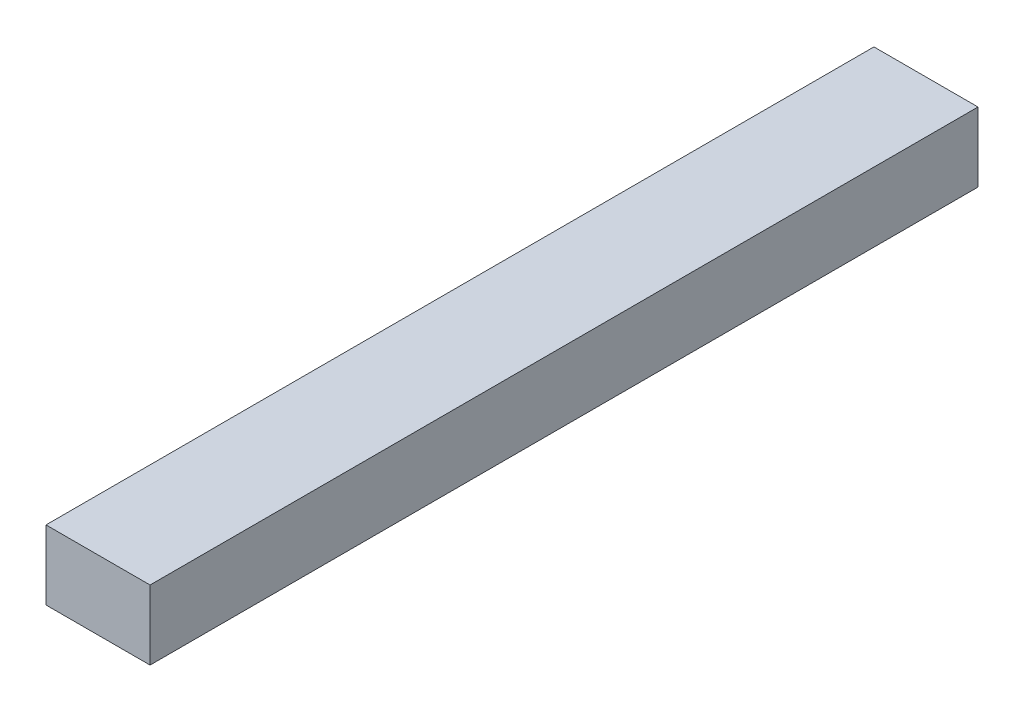
ISO-10303-21;
HEADER;
FILE_DESCRIPTION(('STEP AP214'),'2;1');
FILE_NAME('part.step','',(''),(''),'','','');
FILE_SCHEMA(('AUTOMOTIVE_DESIGN { 1 0 10303 214 1 1 1 1 }'));
ENDSEC;
DATA;
#1=APPLICATION_CONTEXT('core data for automotive mechanical design processes');
#2=APPLICATION_PROTOCOL_DEFINITION('international standard','automotive_design',2000,#1);
#3=PRODUCT_CONTEXT('',#1,'mechanical');
#4=PRODUCT('Part','Part','',(#3));
#5=PRODUCT_RELATED_PRODUCT_CATEGORY('part','',(#4));
#6=PRODUCT_DEFINITION_FORMATION('','',#4);
#7=PRODUCT_DEFINITION_CONTEXT('part definition',#1,'design');
#8=PRODUCT_DEFINITION('design','',#6,#7);
#9=PRODUCT_DEFINITION_SHAPE('','',#8);
#10=(LENGTH_UNIT() NAMED_UNIT(*) SI_UNIT(.MILLI.,.METRE.));
#11=(NAMED_UNIT(*) PLANE_ANGLE_UNIT() SI_UNIT($,.RADIAN.));
#12=(NAMED_UNIT(*) SI_UNIT($,.STERADIAN.) SOLID_ANGLE_UNIT());
#13=UNCERTAINTY_MEASURE_WITH_UNIT(LENGTH_MEASURE(1.E-05),#10,'distance_accuracy_value','');
#14=(GEOMETRIC_REPRESENTATION_CONTEXT(3) GLOBAL_UNCERTAINTY_ASSIGNED_CONTEXT((#13)) GLOBAL_UNIT_ASSIGNED_CONTEXT((#10,
#11,#12)) REPRESENTATION_CONTEXT('',''));
#15=CARTESIAN_POINT('',(0.,0.,0.));
#16=DIRECTION('',(0.,0.,1.));
#17=DIRECTION('',(1.,0.,0.));
#18=AXIS2_PLACEMENT_3D('',#15,#16,#17);
#19=CARTESIAN_POINT('',(-47.1690143822712,38.2481336624736,358.));
#20=DIRECTION('',(1.,0.,0.));
#21=DIRECTION('',(0.,0.,-1.));
#22=AXIS2_PLACEMENT_3D('',#19,#20,#21);
#23=PLANE('',#22);
#24=DIRECTION('',(0.,-1.,0.));
#25=VECTOR('',#24,1.);
#26=CARTESIAN_POINT('',(-47.1690143822712,38.2481336624736,0.));
#27=LINE('',#26,#25);
#28=CARTESIAN_POINT('',(-47.1690143822712,38.2481336624736,0.));
#29=VERTEX_POINT('',#28);
#30=CARTESIAN_POINT('',(-47.1690143822712,8.24813366247365,0.));
#31=VERTEX_POINT('',#30);
#32=EDGE_CURVE('E95',#29,#31,#27,.T.);
#33=ORIENTED_EDGE('',*,*,#32,.T.);
#34=DIRECTION('',(0.,0.,-1.));
#35=VECTOR('',#34,1.);
#36=CARTESIAN_POINT('',(-47.1690143822712,8.24813366247365,358.));
#37=LINE('',#36,#35);
#38=CARTESIAN_POINT('',(-47.1690143822712,8.24813366247365,358.));
#39=VERTEX_POINT('',#38);
#40=EDGE_CURVE('E11',#39,#31,#37,.T.);
#41=ORIENTED_EDGE('',*,*,#40,.F.);
#42=DIRECTION('',(0.,-1.,0.));
#43=VECTOR('',#42,1.);
#44=CARTESIAN_POINT('',(-47.1690143822712,38.2481336624736,358.));
#45=LINE('',#44,#43);
#46=CARTESIAN_POINT('',(-47.1690143822712,38.2481336624736,358.));
#47=VERTEX_POINT('',#46);
#48=EDGE_CURVE('E83',#47,#39,#45,.T.);
#49=ORIENTED_EDGE('',*,*,#48,.F.);
#50=DIRECTION('',(0.,0.,-1.));
#51=VECTOR('',#50,1.);
#52=CARTESIAN_POINT('',(-47.1690143822712,38.2481336624736,358.));
#53=LINE('',#52,#51);
#54=EDGE_CURVE('E91',#47,#29,#53,.T.);
#55=ORIENTED_EDGE('',*,*,#54,.T.);
#56=EDGE_LOOP('',(#33,#41,#49,#55));
#57=FACE_BOUND('',#56,.T.);
#58=ADVANCED_FACE('F32',(#57),#23,.F.);
#59=CARTESIAN_POINT('',(-47.1690143822712,8.24813366247365,358.));
#60=DIRECTION('',(0.,1.,0.));
#61=DIRECTION('',(0.,0.,1.));
#62=AXIS2_PLACEMENT_3D('',#59,#60,#61);
#63=PLANE('',#62);
#64=DIRECTION('',(1.,0.,0.));
#65=VECTOR('',#64,1.);
#66=CARTESIAN_POINT('',(-47.1690143822712,8.24813366247365,0.));
#67=LINE('',#66,#65);
#68=CARTESIAN_POINT('',(-2.16901438227123,8.24813366247365,0.));
#69=VERTEX_POINT('',#68);
#70=EDGE_CURVE('E87',#31,#69,#67,.T.);
#71=ORIENTED_EDGE('',*,*,#70,.T.);
#72=DIRECTION('',(0.,0.,-1.));
#73=VECTOR('',#72,1.);
#74=CARTESIAN_POINT('',(-2.16901438227123,8.24813366247365,358.));
#75=LINE('',#74,#73);
#76=CARTESIAN_POINT('',(-2.16901438227123,8.24813366247365,358.));
#77=VERTEX_POINT('',#76);
#78=EDGE_CURVE('E40',#77,#69,#75,.T.);
#79=ORIENTED_EDGE('',*,*,#78,.F.);
#80=DIRECTION('',(1.,0.,0.));
#81=VECTOR('',#80,1.);
#82=CARTESIAN_POINT('',(-47.1690143822712,8.24813366247365,358.));
#83=LINE('',#82,#81);
#84=EDGE_CURVE('E78',#39,#77,#83,.T.);
#85=ORIENTED_EDGE('',*,*,#84,.F.);
#86=ORIENTED_EDGE('',*,*,#40,.T.);
#87=EDGE_LOOP('',(#71,#79,#85,#86));
#88=FACE_BOUND('',#87,.T.);
#89=ADVANCED_FACE('F86',(#88),#63,.F.);
#90=CARTESIAN_POINT('',(-2.16901438227123,8.24813366247365,358.));
#91=DIRECTION('',(-1.,0.,0.));
#92=DIRECTION('',(0.,0.,1.));
#93=AXIS2_PLACEMENT_3D('',#90,#91,#92);
#94=PLANE('',#93);
#95=DIRECTION('',(0.,1.,0.));
#96=VECTOR('',#95,1.);
#97=CARTESIAN_POINT('',(-2.16901438227123,8.24813366247365,0.));
#98=LINE('',#97,#96);
#99=CARTESIAN_POINT('',(-2.16901438227123,38.2481336624736,0.));
#100=VERTEX_POINT('',#99);
#101=EDGE_CURVE('E65',#69,#100,#98,.T.);
#102=ORIENTED_EDGE('',*,*,#101,.T.);
#103=DIRECTION('',(0.,0.,-1.));
#104=VECTOR('',#103,1.);
#105=CARTESIAN_POINT('',(-2.16901438227123,38.2481336624736,358.));
#106=LINE('',#105,#104);
#107=CARTESIAN_POINT('',(-2.16901438227123,38.2481336624736,358.));
#108=VERTEX_POINT('',#107);
#109=EDGE_CURVE('E88',#108,#100,#106,.T.);
#110=ORIENTED_EDGE('',*,*,#109,.F.);
#111=DIRECTION('',(0.,1.,0.));
#112=VECTOR('',#111,1.);
#113=CARTESIAN_POINT('',(-2.16901438227123,8.24813366247365,358.));
#114=LINE('',#113,#112);
#115=EDGE_CURVE('E81',#77,#108,#114,.T.);
#116=ORIENTED_EDGE('',*,*,#115,.F.);
#117=ORIENTED_EDGE('',*,*,#78,.T.);
#118=EDGE_LOOP('',(#102,#110,#116,#117));
#119=FACE_BOUND('',#118,.T.);
#120=ADVANCED_FACE('F89',(#119),#94,.F.);
#121=CARTESIAN_POINT('',(-2.16901438227123,38.2481336624736,358.));
#122=DIRECTION('',(0.,-1.,0.));
#123=DIRECTION('',(0.,0.,-1.));
#124=AXIS2_PLACEMENT_3D('',#121,#122,#123);
#125=PLANE('',#124);
#126=DIRECTION('',(-1.,0.,0.));
#127=VECTOR('',#126,1.);
#128=CARTESIAN_POINT('',(-2.16901438227123,38.2481336624736,0.));
#129=LINE('',#128,#127);
#130=EDGE_CURVE('E71',#100,#29,#129,.T.);
#131=ORIENTED_EDGE('',*,*,#130,.T.);
#132=ORIENTED_EDGE('',*,*,#54,.F.);
#133=DIRECTION('',(-1.,0.,0.));
#134=VECTOR('',#133,1.);
#135=CARTESIAN_POINT('',(-2.16901438227123,38.2481336624736,358.));
#136=LINE('',#135,#134);
#137=EDGE_CURVE('E48',#108,#47,#136,.T.);
#138=ORIENTED_EDGE('',*,*,#137,.F.);
#139=ORIENTED_EDGE('',*,*,#109,.T.);
#140=EDGE_LOOP('',(#131,#132,#138,#139));
#141=FACE_BOUND('',#140,.T.);
#142=ADVANCED_FACE('F102',(#141),#125,.F.);
#143=CARTESIAN_POINT('',(0.,0.,358.));
#144=DIRECTION('',(0.,0.,1.));
#145=DIRECTION('',(1.,0.,0.));
#146=AXIS2_PLACEMENT_3D('',#143,#144,#145);
#147=PLANE('',#146);
#148=ORIENTED_EDGE('',*,*,#48,.T.);
#149=ORIENTED_EDGE('',*,*,#84,.T.);
#150=ORIENTED_EDGE('',*,*,#115,.T.);
#151=ORIENTED_EDGE('',*,*,#137,.T.);
#152=EDGE_LOOP('',(#148,#149,#150,#151));
#153=FACE_BOUND('',#152,.T.);
#154=ADVANCED_FACE('F79',(#153),#147,.T.);
#155=CARTESIAN_POINT('',(0.,0.,0.));
#156=DIRECTION('',(0.,0.,1.));
#157=DIRECTION('',(1.,0.,0.));
#158=AXIS2_PLACEMENT_3D('',#155,#156,#157);
#159=PLANE('',#158);
#160=ORIENTED_EDGE('',*,*,#32,.F.);
#161=ORIENTED_EDGE('',*,*,#130,.F.);
#162=ORIENTED_EDGE('',*,*,#101,.F.);
#163=ORIENTED_EDGE('',*,*,#70,.F.);
#164=EDGE_LOOP('',(#160,#161,#162,#163));
#165=FACE_BOUND('',#164,.T.);
#166=ADVANCED_FACE('F105',(#165),#159,.F.);
#167=CLOSED_SHELL('',(#58,#89,#120,#142,#154,#166));
#168=MANIFOLD_SOLID_BREP('B2',#167);
#169=ADVANCED_BREP_SHAPE_REPRESENTATION('',(#18,#168),#14);
#170=SHAPE_DEFINITION_REPRESENTATION(#9,#169);
ENDSEC;
END-ISO-10303-21;
